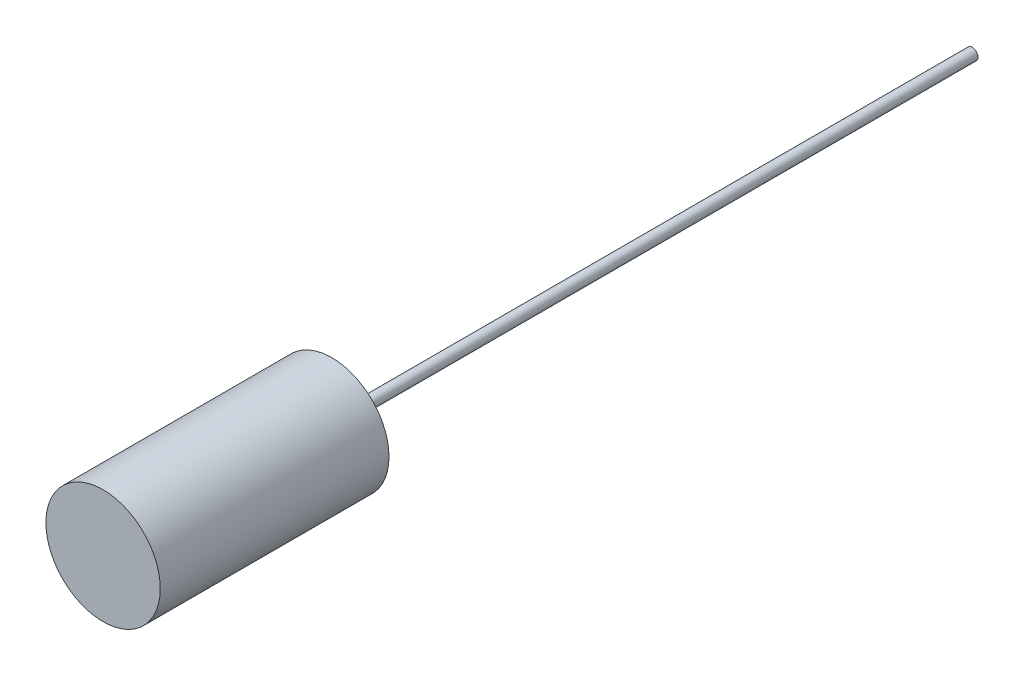
ISO-10303-21;
HEADER;
FILE_DESCRIPTION(('STEP AP214'),'2;1');
FILE_NAME('part.step','',(''),(''),'','','');
FILE_SCHEMA(('AUTOMOTIVE_DESIGN { 1 0 10303 214 1 1 1 1 }'));
ENDSEC;
DATA;
#1=APPLICATION_CONTEXT('core data for automotive mechanical design processes');
#2=APPLICATION_PROTOCOL_DEFINITION('international standard','automotive_design',2000,#1);
#3=PRODUCT_CONTEXT('',#1,'mechanical');
#4=PRODUCT('Part','Part','',(#3));
#5=PRODUCT_RELATED_PRODUCT_CATEGORY('part','',(#4));
#6=PRODUCT_DEFINITION_FORMATION('','',#4);
#7=PRODUCT_DEFINITION_CONTEXT('part definition',#1,'design');
#8=PRODUCT_DEFINITION('design','',#6,#7);
#9=PRODUCT_DEFINITION_SHAPE('','',#8);
#10=(LENGTH_UNIT() NAMED_UNIT(*) SI_UNIT(.MILLI.,.METRE.));
#11=(NAMED_UNIT(*) PLANE_ANGLE_UNIT() SI_UNIT($,.RADIAN.));
#12=(NAMED_UNIT(*) SI_UNIT($,.STERADIAN.) SOLID_ANGLE_UNIT());
#13=UNCERTAINTY_MEASURE_WITH_UNIT(LENGTH_MEASURE(1.E-05),#10,'distance_accuracy_value','');
#14=(GEOMETRIC_REPRESENTATION_CONTEXT(3) GLOBAL_UNCERTAINTY_ASSIGNED_CONTEXT((#13)) GLOBAL_UNIT_ASSIGNED_CONTEXT((#10,
#11,#12)) REPRESENTATION_CONTEXT('',''));
#15=CARTESIAN_POINT('',(0.,0.,0.));
#16=DIRECTION('',(0.,0.,1.));
#17=DIRECTION('',(1.,0.,0.));
#18=AXIS2_PLACEMENT_3D('',#15,#16,#17);
#19=CARTESIAN_POINT('',(0.,0.,20.));
#20=DIRECTION('',(0.,0.,-1.));
#21=DIRECTION('',(-1.,0.,0.));
#22=AXIS2_PLACEMENT_3D('',#19,#20,#21);
#23=CYLINDRICAL_SURFACE('',#22,5.);
#24=CARTESIAN_POINT('',(0.,0.,20.));
#25=DIRECTION('',(0.,0.,1.));
#26=DIRECTION('',(1.,0.,0.));
#27=AXIS2_PLACEMENT_3D('',#24,#25,#26);
#28=CIRCLE('',#27,5.);
#29=CARTESIAN_POINT('',(5.,0.,20.));
#30=VERTEX_POINT('',#29);
#31=EDGE_CURVE('E41',#30,#30,#28,.T.);
#32=ORIENTED_EDGE('',*,*,#31,.F.);
#33=EDGE_LOOP('',(#32));
#34=FACE_BOUND('',#33,.T.);
#35=CARTESIAN_POINT('',(0.,0.,0.));
#36=DIRECTION('',(0.,0.,1.));
#37=DIRECTION('',(1.,0.,0.));
#38=AXIS2_PLACEMENT_3D('',#35,#36,#37);
#39=CIRCLE('',#38,5.);
#40=CARTESIAN_POINT('',(5.,0.,0.));
#41=VERTEX_POINT('',#40);
#42=EDGE_CURVE('E45',#41,#41,#39,.T.);
#43=ORIENTED_EDGE('',*,*,#42,.T.);
#44=EDGE_LOOP('',(#43));
#45=FACE_BOUND('',#44,.T.);
#46=ADVANCED_FACE('F35',(#34,#45),#23,.T.);
#47=CARTESIAN_POINT('',(0.,0.,20.));
#48=DIRECTION('',(0.,0.,1.));
#49=DIRECTION('',(1.,0.,0.));
#50=AXIS2_PLACEMENT_3D('',#47,#48,#49);
#51=PLANE('',#50);
#52=ORIENTED_EDGE('',*,*,#31,.T.);
#53=EDGE_LOOP('',(#52));
#54=FACE_BOUND('',#53,.T.);
#55=ADVANCED_FACE('F66',(#54),#51,.T.);
#56=CARTESIAN_POINT('',(0.,0.,0.));
#57=DIRECTION('',(0.,0.,1.));
#58=DIRECTION('',(1.,0.,0.));
#59=AXIS2_PLACEMENT_3D('',#56,#57,#58);
#60=PLANE('',#59);
#61=CARTESIAN_POINT('',(0.,0.,0.));
#62=DIRECTION('',(0.,0.,1.));
#63=DIRECTION('',(1.,0.,0.));
#64=AXIS2_PLACEMENT_3D('',#61,#62,#63);
#65=CIRCLE('',#64,0.5);
#66=CARTESIAN_POINT('',(0.5,0.,0.));
#67=VERTEX_POINT('',#66);
#68=EDGE_CURVE('E10',#67,#67,#65,.F.);
#69=ORIENTED_EDGE('',*,*,#68,.F.);
#70=EDGE_LOOP('',(#69));
#71=FACE_BOUND('',#70,.T.);
#72=ORIENTED_EDGE('',*,*,#42,.F.);
#73=EDGE_LOOP('',(#72));
#74=FACE_BOUND('',#73,.T.);
#75=ADVANCED_FACE('F59',(#71,#74),#60,.F.);
#76=CARTESIAN_POINT('',(0.,0.,-56.));
#77=DIRECTION('',(0.,0.,1.));
#78=DIRECTION('',(1.,0.,0.));
#79=AXIS2_PLACEMENT_3D('',#76,#77,#78);
#80=CYLINDRICAL_SURFACE('',#79,0.5);
#81=CARTESIAN_POINT('',(0.,0.,-56.));
#82=DIRECTION('',(0.,0.,-1.));
#83=DIRECTION('',(-1.,0.,0.));
#84=AXIS2_PLACEMENT_3D('',#81,#82,#83);
#85=CIRCLE('',#84,0.5);
#86=CARTESIAN_POINT('',(-0.5,0.,-56.));
#87=VERTEX_POINT('',#86);
#88=EDGE_CURVE('E50',#87,#87,#85,.T.);
#89=ORIENTED_EDGE('',*,*,#88,.F.);
#90=EDGE_LOOP('',(#89));
#91=FACE_BOUND('',#90,.T.);
#92=ORIENTED_EDGE('',*,*,#68,.T.);
#93=EDGE_LOOP('',(#92));
#94=FACE_BOUND('',#93,.T.);
#95=ADVANCED_FACE('F57',(#91,#94),#80,.T.);
#96=CARTESIAN_POINT('',(0.,0.,-56.));
#97=DIRECTION('',(0.,0.,-1.));
#98=DIRECTION('',(-1.,0.,0.));
#99=AXIS2_PLACEMENT_3D('',#96,#97,#98);
#100=PLANE('',#99);
#101=ORIENTED_EDGE('',*,*,#88,.T.);
#102=EDGE_LOOP('',(#101));
#103=FACE_BOUND('',#102,.T.);
#104=ADVANCED_FACE('F55',(#103),#100,.T.);
#105=CLOSED_SHELL('',(#46,#55,#75,#95,#104));
#106=MANIFOLD_SOLID_BREP('B2',#105);
#107=ADVANCED_BREP_SHAPE_REPRESENTATION('',(#18,#106),#14);
#108=SHAPE_DEFINITION_REPRESENTATION(#9,#107);
ENDSEC;
END-ISO-10303-21;
